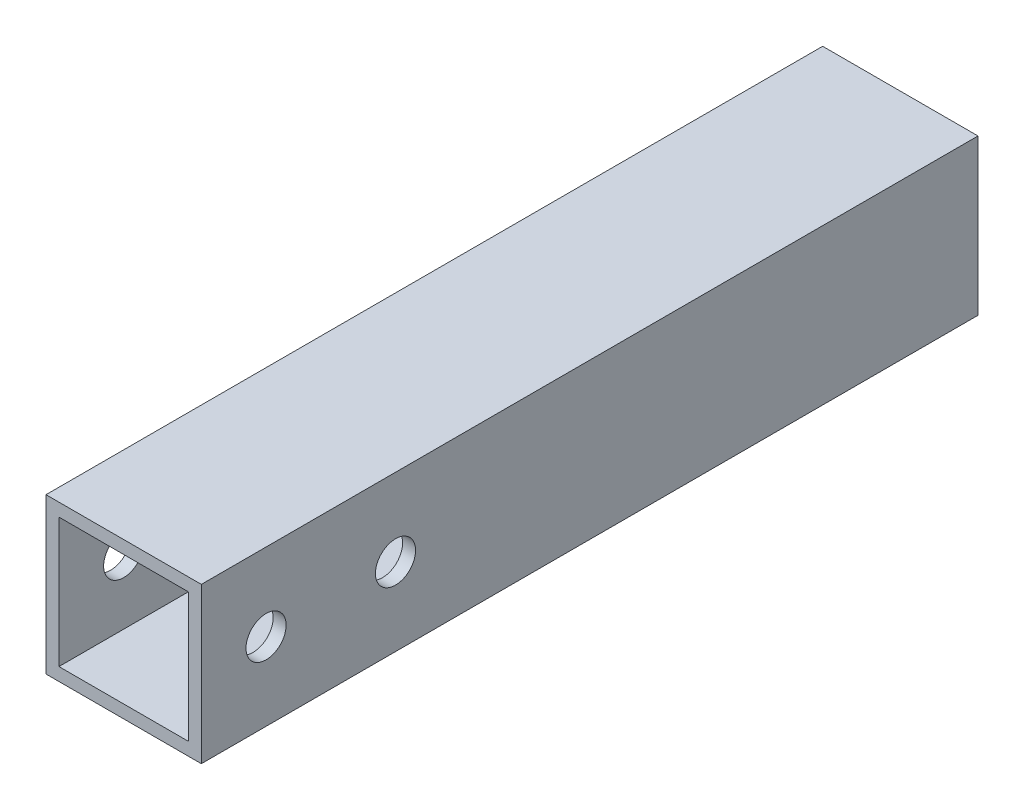
ISO-10303-21;
HEADER;
FILE_DESCRIPTION(('STEP AP214'),'2;1');
FILE_NAME('part.step','',(''),(''),'','','');
FILE_SCHEMA(('AUTOMOTIVE_DESIGN { 1 0 10303 214 1 1 1 1 }'));
ENDSEC;
DATA;
#1=APPLICATION_CONTEXT('core data for automotive mechanical design processes');
#2=APPLICATION_PROTOCOL_DEFINITION('international standard','automotive_design',2000,#1);
#3=PRODUCT_CONTEXT('',#1,'mechanical');
#4=PRODUCT('Part','Part','',(#3));
#5=PRODUCT_RELATED_PRODUCT_CATEGORY('part','',(#4));
#6=PRODUCT_DEFINITION_FORMATION('','',#4);
#7=PRODUCT_DEFINITION_CONTEXT('part definition',#1,'design');
#8=PRODUCT_DEFINITION('design','',#6,#7);
#9=PRODUCT_DEFINITION_SHAPE('','',#8);
#10=(LENGTH_UNIT() NAMED_UNIT(*) SI_UNIT(.MILLI.,.METRE.));
#11=(NAMED_UNIT(*) PLANE_ANGLE_UNIT() SI_UNIT($,.RADIAN.));
#12=(NAMED_UNIT(*) SI_UNIT($,.STERADIAN.) SOLID_ANGLE_UNIT());
#13=UNCERTAINTY_MEASURE_WITH_UNIT(LENGTH_MEASURE(1.E-05),#10,'distance_accuracy_value','');
#14=(GEOMETRIC_REPRESENTATION_CONTEXT(3) GLOBAL_UNCERTAINTY_ASSIGNED_CONTEXT((#13)) GLOBAL_UNIT_ASSIGNED_CONTEXT((#10,
#11,#12)) REPRESENTATION_CONTEXT('',''));
#15=CARTESIAN_POINT('',(0.,0.,0.));
#16=DIRECTION('',(0.,0.,1.));
#17=DIRECTION('',(1.,0.,0.));
#18=AXIS2_PLACEMENT_3D('',#15,#16,#17);
#19=CARTESIAN_POINT('',(0.,0.,60.));
#20=DIRECTION('',(0.,0.,-1.));
#21=DIRECTION('',(-1.,0.,0.));
#22=AXIS2_PLACEMENT_3D('',#19,#20,#21);
#23=PLANE('',#22);
#24=DIRECTION('',(0.,-1.,0.));
#25=VECTOR('',#24,1.);
#26=CARTESIAN_POINT('',(0.,0.,60.));
#27=LINE('',#26,#25);
#28=CARTESIAN_POINT('',(0.,12.,60.));
#29=VERTEX_POINT('',#28);
#30=CARTESIAN_POINT('',(0.,0.,60.));
#31=VERTEX_POINT('',#30);
#32=EDGE_CURVE('E146',#29,#31,#27,.T.);
#33=ORIENTED_EDGE('',*,*,#32,.T.);
#34=DIRECTION('',(1.,0.,0.));
#35=VECTOR('',#34,1.);
#36=CARTESIAN_POINT('',(0.,0.,60.));
#37=LINE('',#36,#35);
#38=CARTESIAN_POINT('',(12.,0.,60.));
#39=VERTEX_POINT('',#38);
#40=EDGE_CURVE('E149',#31,#39,#37,.T.);
#41=ORIENTED_EDGE('',*,*,#40,.T.);
#42=DIRECTION('',(0.,1.,0.));
#43=VECTOR('',#42,1.);
#44=CARTESIAN_POINT('',(12.,0.,60.));
#45=LINE('',#44,#43);
#46=CARTESIAN_POINT('',(12.,12.,60.));
#47=VERTEX_POINT('',#46);
#48=EDGE_CURVE('E152',#39,#47,#45,.T.);
#49=ORIENTED_EDGE('',*,*,#48,.T.);
#50=DIRECTION('',(-1.,0.,0.));
#51=VECTOR('',#50,1.);
#52=CARTESIAN_POINT('',(0.,12.,60.));
#53=LINE('',#52,#51);
#54=EDGE_CURVE('E154',#47,#29,#53,.T.);
#55=ORIENTED_EDGE('',*,*,#54,.T.);
#56=EDGE_LOOP('',(#33,#41,#49,#55));
#57=FACE_BOUND('',#56,.T.);
#58=DIRECTION('',(1.,0.,0.));
#59=VECTOR('',#58,1.);
#60=CARTESIAN_POINT('',(1.,1.,60.));
#61=LINE('',#60,#59);
#62=CARTESIAN_POINT('',(1.,1.,60.));
#63=VERTEX_POINT('',#62);
#64=CARTESIAN_POINT('',(11.,1.,60.));
#65=VERTEX_POINT('',#64);
#66=EDGE_CURVE('E108',#63,#65,#61,.T.);
#67=ORIENTED_EDGE('',*,*,#66,.F.);
#68=DIRECTION('',(0.,-1.,0.));
#69=VECTOR('',#68,1.);
#70=CARTESIAN_POINT('',(1.,1.,60.));
#71=LINE('',#70,#69);
#72=CARTESIAN_POINT('',(1.,11.,60.));
#73=VERTEX_POINT('',#72);
#74=EDGE_CURVE('E130',#73,#63,#71,.T.);
#75=ORIENTED_EDGE('',*,*,#74,.F.);
#76=DIRECTION('',(-1.,0.,0.));
#77=VECTOR('',#76,1.);
#78=CARTESIAN_POINT('',(1.,11.,60.));
#79=LINE('',#78,#77);
#80=CARTESIAN_POINT('',(11.,11.,60.));
#81=VERTEX_POINT('',#80);
#82=EDGE_CURVE('E128',#81,#73,#79,.T.);
#83=ORIENTED_EDGE('',*,*,#82,.F.);
#84=DIRECTION('',(0.,1.,0.));
#85=VECTOR('',#84,1.);
#86=CARTESIAN_POINT('',(11.,1.,60.));
#87=LINE('',#86,#85);
#88=EDGE_CURVE('E116',#65,#81,#87,.T.);
#89=ORIENTED_EDGE('',*,*,#88,.F.);
#90=EDGE_LOOP('',(#67,#75,#83,#89));
#91=FACE_BOUND('',#90,.T.);
#92=ADVANCED_FACE('F41',(#57,#91),#23,.F.);
#93=CARTESIAN_POINT('',(0.,0.,0.));
#94=DIRECTION('',(0.,0.,-1.));
#95=DIRECTION('',(-1.,0.,0.));
#96=AXIS2_PLACEMENT_3D('',#93,#94,#95);
#97=PLANE('',#96);
#98=DIRECTION('',(0.,-1.,0.));
#99=VECTOR('',#98,1.);
#100=CARTESIAN_POINT('',(0.,0.,0.));
#101=LINE('',#100,#99);
#102=CARTESIAN_POINT('',(0.,12.,0.));
#103=VERTEX_POINT('',#102);
#104=CARTESIAN_POINT('',(0.,0.,0.));
#105=VERTEX_POINT('',#104);
#106=EDGE_CURVE('E124',#103,#105,#101,.T.);
#107=ORIENTED_EDGE('',*,*,#106,.F.);
#108=DIRECTION('',(-1.,0.,0.));
#109=VECTOR('',#108,1.);
#110=CARTESIAN_POINT('',(0.,12.,0.));
#111=LINE('',#110,#109);
#112=CARTESIAN_POINT('',(12.,12.,0.));
#113=VERTEX_POINT('',#112);
#114=EDGE_CURVE('E150',#113,#103,#111,.T.);
#115=ORIENTED_EDGE('',*,*,#114,.F.);
#116=DIRECTION('',(0.,1.,0.));
#117=VECTOR('',#116,1.);
#118=CARTESIAN_POINT('',(12.,0.,0.));
#119=LINE('',#118,#117);
#120=CARTESIAN_POINT('',(12.,0.,0.));
#121=VERTEX_POINT('',#120);
#122=EDGE_CURVE('E161',#121,#113,#119,.T.);
#123=ORIENTED_EDGE('',*,*,#122,.F.);
#124=DIRECTION('',(1.,0.,0.));
#125=VECTOR('',#124,1.);
#126=CARTESIAN_POINT('',(0.,0.,0.));
#127=LINE('',#126,#125);
#128=EDGE_CURVE('E159',#105,#121,#127,.T.);
#129=ORIENTED_EDGE('',*,*,#128,.F.);
#130=EDGE_LOOP('',(#107,#115,#123,#129));
#131=FACE_BOUND('',#130,.T.);
#132=DIRECTION('',(0.,-1.,0.));
#133=VECTOR('',#132,1.);
#134=CARTESIAN_POINT('',(1.,1.,0.));
#135=LINE('',#134,#133);
#136=CARTESIAN_POINT('',(1.,11.,0.));
#137=VERTEX_POINT('',#136);
#138=CARTESIAN_POINT('',(1.,1.,0.));
#139=VERTEX_POINT('',#138);
#140=EDGE_CURVE('E117',#137,#139,#135,.T.);
#141=ORIENTED_EDGE('',*,*,#140,.T.);
#142=DIRECTION('',(1.,0.,0.));
#143=VECTOR('',#142,1.);
#144=CARTESIAN_POINT('',(1.,1.,0.));
#145=LINE('',#144,#143);
#146=CARTESIAN_POINT('',(11.,1.,0.));
#147=VERTEX_POINT('',#146);
#148=EDGE_CURVE('E66',#139,#147,#145,.T.);
#149=ORIENTED_EDGE('',*,*,#148,.T.);
#150=DIRECTION('',(0.,1.,0.));
#151=VECTOR('',#150,1.);
#152=CARTESIAN_POINT('',(11.,1.,0.));
#153=LINE('',#152,#151);
#154=CARTESIAN_POINT('',(11.,11.,0.));
#155=VERTEX_POINT('',#154);
#156=EDGE_CURVE('E123',#147,#155,#153,.T.);
#157=ORIENTED_EDGE('',*,*,#156,.T.);
#158=DIRECTION('',(-1.,0.,0.));
#159=VECTOR('',#158,1.);
#160=CARTESIAN_POINT('',(1.,11.,0.));
#161=LINE('',#160,#159);
#162=EDGE_CURVE('E138',#155,#137,#161,.T.);
#163=ORIENTED_EDGE('',*,*,#162,.T.);
#164=EDGE_LOOP('',(#141,#149,#157,#163));
#165=FACE_BOUND('',#164,.T.);
#166=ADVANCED_FACE('F208',(#131,#165),#97,.T.);
#167=CARTESIAN_POINT('',(0.,0.,60.));
#168=DIRECTION('',(1.,0.,0.));
#169=DIRECTION('',(0.,0.,-1.));
#170=AXIS2_PLACEMENT_3D('',#167,#168,#169);
#171=PLANE('',#170);
#172=CARTESIAN_POINT('',(0.,6.,45.));
#173=DIRECTION('',(1.,0.,0.));
#174=DIRECTION('',(0.,0.,-1.));
#175=AXIS2_PLACEMENT_3D('',#172,#173,#174);
#176=CIRCLE('',#175,1.55);
#177=CARTESIAN_POINT('',(0.,6.,43.45));
#178=VERTEX_POINT('',#177);
#179=EDGE_CURVE('E173',#178,#178,#176,.T.);
#180=ORIENTED_EDGE('',*,*,#179,.T.);
#181=EDGE_LOOP('',(#180));
#182=FACE_BOUND('',#181,.T.);
#183=CARTESIAN_POINT('',(0.,6.,55.));
#184=DIRECTION('',(1.,0.,0.));
#185=DIRECTION('',(0.,0.,-1.));
#186=AXIS2_PLACEMENT_3D('',#183,#184,#185);
#187=CIRCLE('',#186,1.55);
#188=CARTESIAN_POINT('',(0.,6.,53.45));
#189=VERTEX_POINT('',#188);
#190=EDGE_CURVE('E189',#189,#189,#187,.T.);
#191=ORIENTED_EDGE('',*,*,#190,.T.);
#192=EDGE_LOOP('',(#191));
#193=FACE_BOUND('',#192,.T.);
#194=ORIENTED_EDGE('',*,*,#106,.T.);
#195=DIRECTION('',(0.,0.,-1.));
#196=VECTOR('',#195,1.);
#197=CARTESIAN_POINT('',(0.,0.,60.));
#198=LINE('',#197,#196);
#199=EDGE_CURVE('E11',#31,#105,#198,.T.);
#200=ORIENTED_EDGE('',*,*,#199,.F.);
#201=ORIENTED_EDGE('',*,*,#32,.F.);
#202=DIRECTION('',(0.,0.,-1.));
#203=VECTOR('',#202,1.);
#204=CARTESIAN_POINT('',(0.,12.,60.));
#205=LINE('',#204,#203);
#206=EDGE_CURVE('E156',#29,#103,#205,.T.);
#207=ORIENTED_EDGE('',*,*,#206,.T.);
#208=EDGE_LOOP('',(#194,#200,#201,#207));
#209=FACE_BOUND('',#208,.T.);
#210=ADVANCED_FACE('F43',(#182,#193,#209),#171,.F.);
#211=CARTESIAN_POINT('',(0.,0.,60.));
#212=DIRECTION('',(0.,1.,0.));
#213=DIRECTION('',(0.,0.,1.));
#214=AXIS2_PLACEMENT_3D('',#211,#212,#213);
#215=PLANE('',#214);
#216=ORIENTED_EDGE('',*,*,#128,.T.);
#217=DIRECTION('',(0.,0.,-1.));
#218=VECTOR('',#217,1.);
#219=CARTESIAN_POINT('',(12.,0.,60.));
#220=LINE('',#219,#218);
#221=EDGE_CURVE('E50',#39,#121,#220,.T.);
#222=ORIENTED_EDGE('',*,*,#221,.F.);
#223=ORIENTED_EDGE('',*,*,#40,.F.);
#224=ORIENTED_EDGE('',*,*,#199,.T.);
#225=EDGE_LOOP('',(#216,#222,#223,#224));
#226=FACE_BOUND('',#225,.T.);
#227=ADVANCED_FACE('F235',(#226),#215,.F.);
#228=CARTESIAN_POINT('',(12.,0.,60.));
#229=DIRECTION('',(-1.,0.,0.));
#230=DIRECTION('',(0.,0.,1.));
#231=AXIS2_PLACEMENT_3D('',#228,#229,#230);
#232=PLANE('',#231);
#233=CARTESIAN_POINT('',(12.,6.,45.));
#234=DIRECTION('',(1.,0.,0.));
#235=DIRECTION('',(0.,0.,-1.));
#236=AXIS2_PLACEMENT_3D('',#233,#234,#235);
#237=CIRCLE('',#236,1.55);
#238=CARTESIAN_POINT('',(12.,6.,43.45));
#239=VERTEX_POINT('',#238);
#240=EDGE_CURVE('E179',#239,#239,#237,.T.);
#241=ORIENTED_EDGE('',*,*,#240,.F.);
#242=EDGE_LOOP('',(#241));
#243=FACE_BOUND('',#242,.T.);
#244=CARTESIAN_POINT('',(12.,6.,55.));
#245=DIRECTION('',(1.,0.,0.));
#246=DIRECTION('',(0.,0.,-1.));
#247=AXIS2_PLACEMENT_3D('',#244,#245,#246);
#248=CIRCLE('',#247,1.55);
#249=CARTESIAN_POINT('',(12.,6.,53.45));
#250=VERTEX_POINT('',#249);
#251=EDGE_CURVE('E184',#250,#250,#248,.T.);
#252=ORIENTED_EDGE('',*,*,#251,.F.);
#253=EDGE_LOOP('',(#252));
#254=FACE_BOUND('',#253,.T.);
#255=ORIENTED_EDGE('',*,*,#122,.T.);
#256=DIRECTION('',(0.,0.,-1.));
#257=VECTOR('',#256,1.);
#258=CARTESIAN_POINT('',(12.,12.,60.));
#259=LINE('',#258,#257);
#260=EDGE_CURVE('E166',#47,#113,#259,.T.);
#261=ORIENTED_EDGE('',*,*,#260,.F.);
#262=ORIENTED_EDGE('',*,*,#48,.F.);
#263=ORIENTED_EDGE('',*,*,#221,.T.);
#264=EDGE_LOOP('',(#255,#261,#262,#263));
#265=FACE_BOUND('',#264,.T.);
#266=ADVANCED_FACE('F232',(#243,#254,#265),#232,.F.);
#267=CARTESIAN_POINT('',(0.,12.,60.));
#268=DIRECTION('',(0.,-1.,0.));
#269=DIRECTION('',(0.,0.,-1.));
#270=AXIS2_PLACEMENT_3D('',#267,#268,#269);
#271=PLANE('',#270);
#272=ORIENTED_EDGE('',*,*,#114,.T.);
#273=ORIENTED_EDGE('',*,*,#206,.F.);
#274=ORIENTED_EDGE('',*,*,#54,.F.);
#275=ORIENTED_EDGE('',*,*,#260,.T.);
#276=EDGE_LOOP('',(#272,#273,#274,#275));
#277=FACE_BOUND('',#276,.T.);
#278=ADVANCED_FACE('F229',(#277),#271,.F.);
#279=CARTESIAN_POINT('',(1.,1.,60.));
#280=DIRECTION('',(0.,1.,0.));
#281=DIRECTION('',(0.,0.,1.));
#282=AXIS2_PLACEMENT_3D('',#279,#280,#281);
#283=PLANE('',#282);
#284=ORIENTED_EDGE('',*,*,#148,.F.);
#285=DIRECTION('',(0.,0.,-1.));
#286=VECTOR('',#285,1.);
#287=CARTESIAN_POINT('',(1.,1.,60.));
#288=LINE('',#287,#286);
#289=EDGE_CURVE('E112',#63,#139,#288,.T.);
#290=ORIENTED_EDGE('',*,*,#289,.F.);
#291=ORIENTED_EDGE('',*,*,#66,.T.);
#292=DIRECTION('',(0.,0.,-1.));
#293=VECTOR('',#292,1.);
#294=CARTESIAN_POINT('',(11.,1.,60.));
#295=LINE('',#294,#293);
#296=EDGE_CURVE('E111',#65,#147,#295,.T.);
#297=ORIENTED_EDGE('',*,*,#296,.T.);
#298=EDGE_LOOP('',(#284,#290,#291,#297));
#299=FACE_BOUND('',#298,.T.);
#300=ADVANCED_FACE('F110',(#299),#283,.T.);
#301=CARTESIAN_POINT('',(11.,1.,60.));
#302=DIRECTION('',(-1.,0.,0.));
#303=DIRECTION('',(0.,0.,1.));
#304=AXIS2_PLACEMENT_3D('',#301,#302,#303);
#305=PLANE('',#304);
#306=CARTESIAN_POINT('',(11.,6.,45.));
#307=DIRECTION('',(-1.,0.,0.));
#308=DIRECTION('',(0.,0.,1.));
#309=AXIS2_PLACEMENT_3D('',#306,#307,#308);
#310=CIRCLE('',#309,1.55);
#311=CARTESIAN_POINT('',(11.,6.,46.55));
#312=VERTEX_POINT('',#311);
#313=EDGE_CURVE('E136',#312,#312,#310,.T.);
#314=ORIENTED_EDGE('',*,*,#313,.F.);
#315=EDGE_LOOP('',(#314));
#316=FACE_BOUND('',#315,.T.);
#317=CARTESIAN_POINT('',(11.,6.,55.));
#318=DIRECTION('',(-1.,0.,0.));
#319=DIRECTION('',(0.,0.,1.));
#320=AXIS2_PLACEMENT_3D('',#317,#318,#319);
#321=CIRCLE('',#320,1.55);
#322=CARTESIAN_POINT('',(11.,6.,56.55));
#323=VERTEX_POINT('',#322);
#324=EDGE_CURVE('E172',#323,#323,#321,.T.);
#325=ORIENTED_EDGE('',*,*,#324,.F.);
#326=EDGE_LOOP('',(#325));
#327=FACE_BOUND('',#326,.T.);
#328=ORIENTED_EDGE('',*,*,#156,.F.);
#329=ORIENTED_EDGE('',*,*,#296,.F.);
#330=ORIENTED_EDGE('',*,*,#88,.T.);
#331=DIRECTION('',(0.,0.,-1.));
#332=VECTOR('',#331,1.);
#333=CARTESIAN_POINT('',(11.,11.,60.));
#334=LINE('',#333,#332);
#335=EDGE_CURVE('E125',#81,#155,#334,.T.);
#336=ORIENTED_EDGE('',*,*,#335,.T.);
#337=EDGE_LOOP('',(#328,#329,#330,#336));
#338=FACE_BOUND('',#337,.T.);
#339=ADVANCED_FACE('F120',(#316,#327,#338),#305,.T.);
#340=CARTESIAN_POINT('',(1.,11.,60.));
#341=DIRECTION('',(0.,-1.,0.));
#342=DIRECTION('',(0.,0.,-1.));
#343=AXIS2_PLACEMENT_3D('',#340,#341,#342);
#344=PLANE('',#343);
#345=ORIENTED_EDGE('',*,*,#162,.F.);
#346=ORIENTED_EDGE('',*,*,#335,.F.);
#347=ORIENTED_EDGE('',*,*,#82,.T.);
#348=DIRECTION('',(0.,0.,-1.));
#349=VECTOR('',#348,1.);
#350=CARTESIAN_POINT('',(1.,11.,60.));
#351=LINE('',#350,#349);
#352=EDGE_CURVE('E58',#73,#137,#351,.T.);
#353=ORIENTED_EDGE('',*,*,#352,.T.);
#354=EDGE_LOOP('',(#345,#346,#347,#353));
#355=FACE_BOUND('',#354,.T.);
#356=ADVANCED_FACE('F204',(#355),#344,.T.);
#357=CARTESIAN_POINT('',(1.,1.,60.));
#358=DIRECTION('',(1.,0.,0.));
#359=DIRECTION('',(0.,0.,-1.));
#360=AXIS2_PLACEMENT_3D('',#357,#358,#359);
#361=PLANE('',#360);
#362=CARTESIAN_POINT('',(1.,6.,45.));
#363=DIRECTION('',(1.,0.,0.));
#364=DIRECTION('',(0.,0.,-1.));
#365=AXIS2_PLACEMENT_3D('',#362,#363,#364);
#366=CIRCLE('',#365,1.55);
#367=CARTESIAN_POINT('',(1.,6.,43.45));
#368=VERTEX_POINT('',#367);
#369=EDGE_CURVE('E45',#368,#368,#366,.T.);
#370=ORIENTED_EDGE('',*,*,#369,.F.);
#371=EDGE_LOOP('',(#370));
#372=FACE_BOUND('',#371,.T.);
#373=CARTESIAN_POINT('',(1.,6.,55.));
#374=DIRECTION('',(1.,0.,0.));
#375=DIRECTION('',(0.,0.,-1.));
#376=AXIS2_PLACEMENT_3D('',#373,#374,#375);
#377=CIRCLE('',#376,1.55);
#378=CARTESIAN_POINT('',(1.,6.,53.45));
#379=VERTEX_POINT('',#378);
#380=EDGE_CURVE('E170',#379,#379,#377,.T.);
#381=ORIENTED_EDGE('',*,*,#380,.F.);
#382=EDGE_LOOP('',(#381));
#383=FACE_BOUND('',#382,.T.);
#384=ORIENTED_EDGE('',*,*,#140,.F.);
#385=ORIENTED_EDGE('',*,*,#352,.F.);
#386=ORIENTED_EDGE('',*,*,#74,.T.);
#387=ORIENTED_EDGE('',*,*,#289,.T.);
#388=EDGE_LOOP('',(#384,#385,#386,#387));
#389=FACE_BOUND('',#388,.T.);
#390=ADVANCED_FACE('F200',(#372,#383,#389),#361,.T.);
#391=CARTESIAN_POINT('',(0.,6.,55.));
#392=DIRECTION('',(1.,0.,0.));
#393=DIRECTION('',(0.,0.,-1.));
#394=AXIS2_PLACEMENT_3D('',#391,#392,#393);
#395=CYLINDRICAL_SURFACE('',#394,1.55);
#396=ORIENTED_EDGE('',*,*,#380,.T.);
#397=EDGE_LOOP('',(#396));
#398=FACE_BOUND('',#397,.T.);
#399=ORIENTED_EDGE('',*,*,#190,.F.);
#400=EDGE_LOOP('',(#399));
#401=FACE_BOUND('',#400,.T.);
#402=ADVANCED_FACE('F203',(#398,#401),#395,.F.);
#403=CARTESIAN_POINT('',(0.,6.,45.));
#404=DIRECTION('',(1.,0.,0.));
#405=DIRECTION('',(0.,0.,-1.));
#406=AXIS2_PLACEMENT_3D('',#403,#404,#405);
#407=CYLINDRICAL_SURFACE('',#406,1.55);
#408=ORIENTED_EDGE('',*,*,#369,.T.);
#409=EDGE_LOOP('',(#408));
#410=FACE_BOUND('',#409,.T.);
#411=ORIENTED_EDGE('',*,*,#179,.F.);
#412=EDGE_LOOP('',(#411));
#413=FACE_BOUND('',#412,.T.);
#414=ADVANCED_FACE('F197',(#410,#413),#407,.F.);
#415=ORIENTED_EDGE('',*,*,#324,.T.);
#416=EDGE_LOOP('',(#415));
#417=FACE_BOUND('',#416,.T.);
#418=ORIENTED_EDGE('',*,*,#251,.T.);
#419=EDGE_LOOP('',(#418));
#420=FACE_BOUND('',#419,.T.);
#421=ADVANCED_FACE('F260',(#417,#420),#395,.F.);
#422=ORIENTED_EDGE('',*,*,#313,.T.);
#423=EDGE_LOOP('',(#422));
#424=FACE_BOUND('',#423,.T.);
#425=ORIENTED_EDGE('',*,*,#240,.T.);
#426=EDGE_LOOP('',(#425));
#427=FACE_BOUND('',#426,.T.);
#428=ADVANCED_FACE('F265',(#424,#427),#407,.F.);
#429=CLOSED_SHELL('',(#92,#166,#210,#227,#266,#278,#300,#339,#356,#390,#402,#414,#421,#428));
#430=MANIFOLD_SOLID_BREP('B2',#429);
#431=ADVANCED_BREP_SHAPE_REPRESENTATION('',(#18,#430),#14);
#432=SHAPE_DEFINITION_REPRESENTATION(#9,#431);
ENDSEC;
END-ISO-10303-21;
